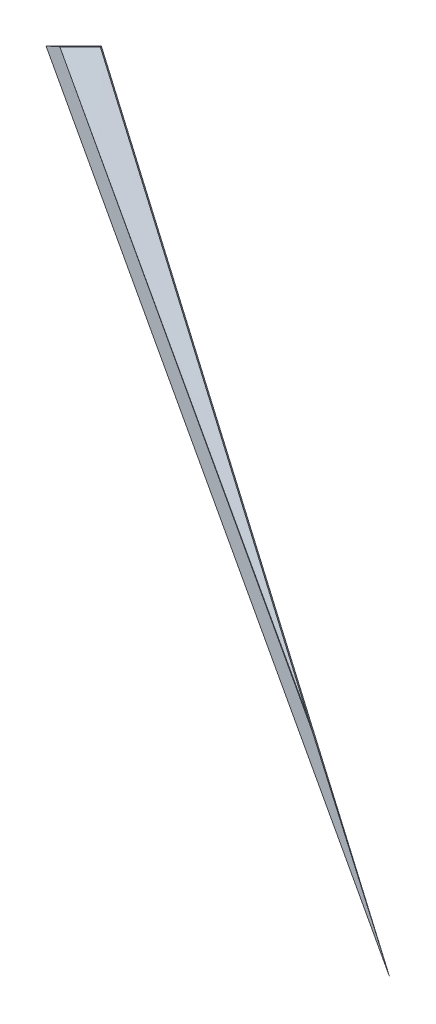
ISO-10303-21;
HEADER;
FILE_DESCRIPTION(('STEP AP214'),'2;1');
FILE_NAME('part.step','',(''),(''),'','','');
FILE_SCHEMA(('AUTOMOTIVE_DESIGN { 1 0 10303 214 1 1 1 1 }'));
ENDSEC;
DATA;
#1=APPLICATION_CONTEXT('core data for automotive mechanical design processes');
#2=APPLICATION_PROTOCOL_DEFINITION('international standard','automotive_design',2000,#1);
#3=PRODUCT_CONTEXT('',#1,'mechanical');
#4=PRODUCT('Part','Part','',(#3));
#5=PRODUCT_RELATED_PRODUCT_CATEGORY('part','',(#4));
#6=PRODUCT_DEFINITION_FORMATION('','',#4);
#7=PRODUCT_DEFINITION_CONTEXT('part definition',#1,'design');
#8=PRODUCT_DEFINITION('design','',#6,#7);
#9=PRODUCT_DEFINITION_SHAPE('','',#8);
#10=(LENGTH_UNIT() NAMED_UNIT(*) SI_UNIT(.MILLI.,.METRE.));
#11=(NAMED_UNIT(*) PLANE_ANGLE_UNIT() SI_UNIT($,.RADIAN.));
#12=(NAMED_UNIT(*) SI_UNIT($,.STERADIAN.) SOLID_ANGLE_UNIT());
#13=UNCERTAINTY_MEASURE_WITH_UNIT(LENGTH_MEASURE(1.E-05),#10,'distance_accuracy_value','');
#14=(GEOMETRIC_REPRESENTATION_CONTEXT(3) GLOBAL_UNCERTAINTY_ASSIGNED_CONTEXT((#13)) GLOBAL_UNIT_ASSIGNED_CONTEXT((#10,
#11,#12)) REPRESENTATION_CONTEXT('',''));
#15=CARTESIAN_POINT('',(0.,0.,0.));
#16=DIRECTION('',(0.,0.,1.));
#17=DIRECTION('',(1.,0.,0.));
#18=AXIS2_PLACEMENT_3D('',#15,#16,#17);
#19=CARTESIAN_POINT('',(-43.7794599718674,348.054082561375,128.512156547839));
#20=DIRECTION('',(0.320862040401385,0.0996172698804472,-0.941872576610566));
#21=DIRECTION('',(-0.946581032931167,0.,-0.322466041770238));
#22=AXIS2_PLACEMENT_3D('',#19,#20,#21);
#23=PLANE('',#22);
#24=CARTESIAN_POINT('',(-297.668741007395,361.646186737307,43.4587996198292));
#25=CARTESIAN_POINT('',(-290.734837231368,352.952606488045,44.9014531351215));
#26=CARTESIAN_POINT('',(-283.801097103595,344.258883957929,46.3440358529999));
#27=CARTESIAN_POINT('',(-269.93403174818,326.871078181952,49.2290217960901));
#28=CARTESIAN_POINT('',(-263.000706520539,318.176994936089,50.6714250213013));
#29=CARTESIAN_POINT('',(-249.13455930115,300.788392492688,53.5560139289091));
#30=CARTESIAN_POINT('',(-242.201737309353,292.093873295192,54.9981996113274));
#31=CARTESIAN_POINT('',(-228.336719033221,274.704291132399,57.8823003085134));
#32=CARTESIAN_POINT('',(-221.404522748887,266.009228167102,59.3242153232814));
#33=CARTESIAN_POINT('',(-206.979027083692,247.913566130506,62.3245718410815));
#34=CARTESIAN_POINT('',(-199.485794275591,238.512909212985,63.8829845470611));
#35=CARTESIAN_POINT('',(-184.500541335244,219.710541960795,66.999285429268));
#36=CARTESIAN_POINT('',(-177.008521202994,210.308831626128,68.5571736054967));
#37=CARTESIAN_POINT('',(-162.026121864654,191.503982930224,71.6722399181455));
#38=CARTESIAN_POINT('',(-154.535742658878,182.100844568712,73.2294180544297));
#39=CARTESIAN_POINT('',(-139.557273880719,163.292580400108,76.3427841289939));
#40=CARTESIAN_POINT('',(-132.069184308326,153.887454593026,77.8989720672789));
#41=CARTESIAN_POINT('',(-120.83956964729,139.777563962203,80.2321627182002));
#42=CARTESIAN_POINT('',(-117.096780853249,135.07389524907,81.0097118599945));
#43=CARTESIAN_POINT('',(-109.612252215599,125.665648549833,82.5643566346079));
#44=CARTESIAN_POINT('',(-105.870512371966,120.96107056375,83.3414522674373));
#45=CARTESIAN_POINT('',(-98.3883474690405,111.550779158204,84.8950755442062));
#46=CARTESIAN_POINT('',(-94.6479224091125,106.845065739291,85.6716031884202));
#47=CARTESIAN_POINT('',(-87.1687477131642,97.4321874708849,87.223934209572));
#48=CARTESIAN_POINT('',(-83.4299980772753,92.7250226212772,87.999737586453));
#49=CARTESIAN_POINT('',(-77.2005670496034,84.8781532171149,89.2919551041424));
#50=CARTESIAN_POINT('',(-74.7092761416948,81.738975930076,89.8086326516412));
#51=CARTESIAN_POINT('',(-69.7278803553843,75.4595964957376,90.8414753146593));
#52=CARTESIAN_POINT('',(-67.2377754769011,72.3193943485083,91.3576404302139));
#53=CARTESIAN_POINT('',(-62.2590220064572,66.0377334720408,92.3893416544394));
#54=CARTESIAN_POINT('',(-59.7703734142002,62.8962747430586,92.9048777632384));
#55=CARTESIAN_POINT('',(-54.7948894593718,56.6117853933132,93.9351660275048));
#56=CARTESIAN_POINT('',(-52.3080540994935,53.4687547702271,94.4499181818091));
#57=CARTESIAN_POINT('',(-47.336688284403,47.1807072070455,95.4784272094051));
#58=CARTESIAN_POINT('',(-44.8521578295679,44.0356902666253,95.992184082534));
#59=CARTESIAN_POINT('',(-41.1276090285872,39.3162311218819,96.7618494391306));
#60=CARTESIAN_POINT('',(-39.8864666830658,37.7427550751875,97.0182430144565));
#61=CARTESIAN_POINT('',(-37.4050513044177,34.5950563938029,97.5306550587348));
#62=CARTESIAN_POINT('',(-36.1647782713725,33.0208337590427,97.7866735276519));
#63=CARTESIAN_POINT('',(-34.9249999999667,31.4461867373069,98.0424785637693));
#64=B_SPLINE_CURVE_WITH_KNOTS('',3,(#24,#25,#26,#27,#28,#29,#30,#31,#32,#33,#34,#35,#36,#37,#38,
#39,#40,#41,#42,#43,#44,#45,#46,#47,#48,#49,#50,#51,#52,#53,#54,#55,#56,#57,#58,#59,#60,#61,#62,
#63),.UNSPECIFIED.,.F.,.F.,(4,2,2,2,2,2,2,2,2,2,2,2,2,2,2,2,2,2,2,4),(0.,33.6399684172129,
67.2799369411519,100.919902126164,134.559867272925,170.926690627021,207.293513887514,
243.660344114447,280.027174158575,298.21062666626,316.394078765369,334.577522073942,
352.76096680686,364.883312892877,377.005658149082,389.128000938074,401.250361695772,
413.372724436773,419.433911269494,425.495098671373),.UNSPECIFIED.);
#65=CARTESIAN_POINT('',(-297.668741542232,361.646186737307,43.4588001512512));
#66=VERTEX_POINT('',#65);
#67=CARTESIAN_POINT('',(-127.021603680379,147.545094915806,78.9477004072457));
#68=VERTEX_POINT('',#67);
#69=EDGE_CURVE('E200',#66,#68,#64,.T.);
#70=ORIENTED_EDGE('',*,*,#69,.T.);
#71=DIRECTION('',(-0.496730625068421,0.864411263879369,-0.0777936565383566));
#72=VECTOR('',#71,1.);
#73=CARTESIAN_POINT('',(-190.661492058989,258.291309403625,68.980971220812));
#74=LINE('',#73,#72);
#75=CARTESIAN_POINT('',(-163.166684475801,210.444810368408,73.2869703071807));
#76=VERTEX_POINT('',#75);
#77=EDGE_CURVE('E44',#68,#76,#74,.T.);
#78=ORIENTED_EDGE('',*,*,#77,.T.);
#79=CARTESIAN_POINT('',(-288.991942465316,368.569183758141,47.1468837972769));
#80=CARTESIAN_POINT('',(-277.176160376147,353.720231922855,49.6015936646894));
#81=CARTESIAN_POINT('',(-265.360372672012,338.871284956906,52.056305959925));
#82=CARTESIAN_POINT('',(-241.728778223119,309.173407535539,56.9657387830881));
#83=CARTESIAN_POINT('',(-229.912971478361,294.324477080122,59.4204593110157));
#84=CARTESIAN_POINT('',(-206.281331139202,264.626639453767,64.3299119762628));
#85=CARTESIAN_POINT('',(-194.4654975448,249.777732282829,66.7846441135824));
#86=CARTESIAN_POINT('',(-170.833788907019,220.079953887667,71.6941263103031));
#87=CARTESIAN_POINT('',(-159.017913863639,205.231082663442,74.1488763697041));
#88=CARTESIAN_POINT('',(-137.121299734128,177.714000399608,78.697915999562));
#89=CARTESIAN_POINT('',(-127.040569998214,165.045781251254,80.7922015271146));
#90=CARTESIAN_POINT('',(-106.879026578929,139.70941575874,84.9808088802371));
#91=CARTESIAN_POINT('',(-96.7982128955589,127.041269414581,87.075130705807));
#92=CARTESIAN_POINT('',(-76.6364336295457,101.705108454056,91.2638400357607));
#93=CARTESIAN_POINT('',(-66.5554680469028,89.0370938376907,93.3582275401446));
#94=CARTESIAN_POINT('',(-51.4337702057868,70.0352882688985,96.4999166640812));
#95=CARTESIAN_POINT('',(-46.3931626800952,63.7013891375956,97.5471643501186));
#96=CARTESIAN_POINT('',(-36.3117975323069,51.0337210558875,99.6417246232276));
#97=CARTESIAN_POINT('',(-31.2710399102102,44.6999521054824,100.689037210299));
#98=CARTESIAN_POINT('',(-26.2301737705843,38.3662772779605,101.7363967203));
#99=B_SPLINE_CURVE_WITH_KNOTS('',3,(#79,#80,#81,#82,#83,#84,#85,#86,#87,#88,#89,#90,#91,#92,#93,
#94,#95,#96,#97,#98),.UNSPECIFIED.,.F.,.F.,(4,2,2,2,2,2,2,2,2,4),(0.,57.4035460374113,
114.807092078777,172.210638119967,229.614184158014,278.58783301537,327.561481868416,
376.535130736395,401.021955178102,425.508779626037),.UNSPECIFIED.);
#100=CARTESIAN_POINT('',(-288.445979296067,367.883069094712,47.2603067692651));
#101=VERTEX_POINT('',#100);
#102=EDGE_CURVE('E92',#101,#76,#99,.T.);
#103=ORIENTED_EDGE('',*,*,#102,.F.);
#104=CARTESIAN_POINT('',(-297.668741201082,361.646186605967,43.4587995399557));
#105=CARTESIAN_POINT('',(-297.284680488669,361.906518556013,43.6169732194297));
#106=CARTESIAN_POINT('',(-296.900592144994,362.166792846223,43.7751747077112));
#107=CARTESIAN_POINT('',(-296.132360196487,362.687226053781,44.0916333005164));
#108=CARTESIAN_POINT('',(-295.748216591655,362.947384971126,44.2498904050412));
#109=CARTESIAN_POINT('',(-294.979874122189,363.467587379757,44.5664602289685));
#110=CARTESIAN_POINT('',(-294.595675257554,363.727630871037,44.7247729483734));
#111=CARTESIAN_POINT('',(-293.827222269861,364.247602374327,45.0414540006726));
#112=CARTESIAN_POINT('',(-293.4429681468,364.50753038633,45.1998223335704));
#113=CARTESIAN_POINT('',(-292.674404643652,365.027270877842,45.5166146114519));
#114=CARTESIAN_POINT('',(-292.290095263561,365.287083357343,45.6750385564402));
#115=CARTESIAN_POINT('',(-291.521421247763,365.806592730617,45.9919420570808));
#116=CARTESIAN_POINT('',(-291.137056612051,366.066289624379,46.1504216127389));
#117=CARTESIAN_POINT('',(-290.368272086441,366.585567772931,46.4674363332822));
#118=CARTESIAN_POINT('',(-289.983852196535,366.845149027706,46.6259714981742));
#119=CARTESIAN_POINT('',(-289.214957163991,367.364195845026,46.9430974357243));
#120=CARTESIAN_POINT('',(-288.830482021344,367.623661407553,47.1016882083903));
#121=CARTESIAN_POINT('',(-288.4459792844,367.883069076182,47.2603067712797));
#122=B_SPLINE_CURVE_WITH_KNOTS('',3,(#104,#105,#106,#107,#108,#109,#110,#111,#112,#113,#114,
#115,#116,#117,#118,#119,#120,#121),.UNSPECIFIED.,.F.,.F.,(4,2,2,2,2,2,2,2,4),(0.,
1.470594572505,2.94118917486206,4.41178383696294,5.88237858873328,7.35297346013329,
8.82356848115738,10.2941636818343,11.7647590922271),.UNSPECIFIED.);
#123=EDGE_CURVE('E77',#101,#66,#122,.F.);
#124=ORIENTED_EDGE('',*,*,#123,.T.);
#125=EDGE_LOOP('',(#70,#78,#103,#124));
#126=FACE_BOUND('',#125,.T.);
#127=ADVANCED_FACE('F38',(#126),#23,.F.);
#128=CARTESIAN_POINT('',(-108.724229990897,312.439251428831,147.462223686257));
#129=DIRECTION('',(0.573127406974514,0.259388760360691,-0.777330332852909));
#130=DIRECTION('',(-0.804878930909419,0.,-0.593439050432403));
#131=AXIS2_PLACEMENT_3D('',#128,#129,#130);
#132=PLANE('',#131);
#133=CARTESIAN_POINT('',(-286.757859557842,361.646186737307,32.6175781807756));
#134=CARTESIAN_POINT('',(-283.324879280508,357.011977166067,33.6023245315298));
#135=CARTESIAN_POINT('',(-279.891473903881,352.378178145007,34.5875213061813));
#136=CARTESIAN_POINT('',(-273.023706396748,343.111506066348,36.5589292586926));
#137=CARTESIAN_POINT('',(-269.589344266381,338.478633008615,37.5451404364053));
#138=CARTESIAN_POINT('',(-262.719556232259,329.213917092226,39.5186908833365));
#139=CARTESIAN_POINT('',(-259.284130328667,324.58207423341,40.5060301523805));
#140=CARTESIAN_POINT('',(-252.412086156816,315.319543866885,42.4819733548205));
#141=CARTESIAN_POINT('',(-248.975467888711,310.688856359024,43.470577288052));
#142=CARTESIAN_POINT('',(-242.100924747281,301.428828039547,45.4491978989877));
#143=CARTESIAN_POINT('',(-238.66299988754,296.799487214768,46.4392145622841));
#144=CARTESIAN_POINT('',(-231.785633902103,287.542275609962,48.4208563770674));
#145=CARTESIAN_POINT('',(-228.346192776269,282.914404830069,49.4124815287014));
#146=CARTESIAN_POINT('',(-221.465587615851,273.660334081903,51.3975596726163));
#147=CARTESIAN_POINT('',(-218.024423580753,269.034134114128,52.3910126654435));
#148=CARTESIAN_POINT('',(-211.14012677169,259.783643800331,54.3800074318285));
#149=CARTESIAN_POINT('',(-207.69699399652,255.159353455479,55.3755492066656));
#150=CARTESIAN_POINT('',(-200.808354849825,245.912820715994,57.3690661984851));
#151=CARTESIAN_POINT('',(-197.36284840357,241.290578394143,58.3670414948528));
#152=CARTESIAN_POINT('',(-190.469222264212,232.048644449128,60.3657699876248));
#153=CARTESIAN_POINT('',(-187.021102571434,227.428952825647,61.3665231836842));
#154=CARTESIAN_POINT('',(-180.121821476563,218.192550525306,63.3712669523906));
#155=CARTESIAN_POINT('',(-176.670660077157,213.575839845821,64.3752575221816));
#156=CARTESIAN_POINT('',(-169.764766700067,204.345927696207,66.3870422515745));
#157=CARTESIAN_POINT('',(-166.310034726793,199.732726221758,67.3948364064839));
#158=CARTESIAN_POINT('',(-159.396301299201,190.510439345044,69.4149461138513));
#159=CARTESIAN_POINT('',(-155.937299802372,185.901353984561,70.4272617115948));
#160=CARTESIAN_POINT('',(-149.014233232903,176.688173597478,72.4572915264554));
#161=CARTESIAN_POINT('',(-145.550168158609,172.084078572506,73.4750057453347));
#162=CARTESIAN_POINT('',(-140.349469513132,165.182483302767,75.0064868123872));
#163=CARTESIAN_POINT('',(-138.615134167171,162.882706392183,75.5177994691999));
#164=CARTESIAN_POINT('',(-135.144766476657,158.284837685361,76.5422382925585));
#165=CARTESIAN_POINT('',(-133.408734132276,155.986745888953,77.0553644589202));
#166=CARTESIAN_POINT('',(-129.934780113806,151.392416110681,78.0836284014148));
#167=CARTESIAN_POINT('',(-128.196858427237,149.096178141241,78.5987661908956));
#168=CARTESIAN_POINT('',(-124.718919252398,144.505793408598,79.6312848275553));
#169=CARTESIAN_POINT('',(-122.978901763381,142.211646646142,80.148665675535));
#170=CARTESIAN_POINT('',(-121.237727997419,139.918657356266,80.6672852882252));
#171=B_SPLINE_CURVE_WITH_KNOTS('',3,(#133,#134,#135,#136,#137,#138,#139,#140,#141,#142,#143,
#144,#145,#146,#147,#148,#149,#150,#151,#152,#153,#154,#155,#156,#157,#158,#159,#160,#161,#162,
#163,#164,#165,#166,#167,#168,#169,#170),.UNSPECIFIED.,.F.,.F.,(4,2,2,2,2,2,2,2,2,2,2,2,2,2,2,2,
2,2,4),(0.,17.552173572479,35.1043445993098,52.6565129101434,70.2086789384544,87.7606672205361,
105.312657108009,122.864652241527,140.416658127242,157.969244458604,175.5218286105,
193.074397281571,210.62694430465,228.17966752506,245.732396475044,254.50878411403,
263.285170861463,272.061615943047,280.838064158074),.UNSPECIFIED.);
#172=CARTESIAN_POINT('',(-286.757859557842,361.646186737307,32.6175781807756));
#173=VERTEX_POINT('',#172);
#174=EDGE_CURVE('E56',#173,#68,#171,.T.);
#175=ORIENTED_EDGE('',*,*,#174,.F.);
#176=CARTESIAN_POINT('',(-280.4456428073,367.850614043495,39.3419563573161));
#177=CARTESIAN_POINT('',(-281.508104015321,366.806075040956,38.2100472100795));
#178=CARTESIAN_POINT('',(-282.570613385615,365.761600279045,37.0781239892606));
#179=CARTESIAN_POINT('',(-284.164449569809,364.194984348807,35.3802180827064));
#180=CARTESIAN_POINT('',(-284.695740321155,363.672795072375,34.8142459326918));
#181=CARTESIAN_POINT('',(-285.758345846837,362.628448566472,33.6822946142679));
#182=CARTESIAN_POINT('',(-286.289660621172,362.106291337002,33.1163154458585));
#183=CARTESIAN_POINT('',(-286.820987396641,361.584150119446,32.5503327720306));
#184=B_SPLINE_CURVE_WITH_KNOTS('',3,(#176,#177,#178,#179,#180,#181,#182,#183),.UNSPECIFIED.,.F.,
.F.,(4,2,2,4),(0.,5.61337106720591,8.42005662007123,11.2267421782396),.UNSPECIFIED.);
#185=CARTESIAN_POINT('',(-280.445642947806,367.850614124864,39.3419563310312));
#186=VERTEX_POINT('',#185);
#187=EDGE_CURVE('E198',#186,#173,#184,.T.);
#188=ORIENTED_EDGE('',*,*,#187,.F.);
#189=CARTESIAN_POINT('',(-280.445643025809,367.850614210294,39.3419562518684));
#190=CARTESIAN_POINT('',(-277.46401444205,363.82621562409,40.1974089084731));
#191=CARTESIAN_POINT('',(-274.482033070197,359.802157825853,41.0532353946855));
#192=CARTESIAN_POINT('',(-268.51728339212,351.754803003423,42.7657224396593));
#193=CARTESIAN_POINT('',(-265.534515085894,347.731505979229,43.6223829984216));
#194=CARTESIAN_POINT('',(-259.568110322113,339.68575209345,45.3366245612537));
#195=CARTESIAN_POINT('',(-256.584473864598,335.663295231826,46.1942055652818));
#196=CARTESIAN_POINT('',(-250.616236578857,327.619315610051,47.9103903080405));
#197=CARTESIAN_POINT('',(-247.631635750694,323.59779284984,48.7689940467061));
#198=CARTESIAN_POINT('',(-241.661381467194,315.555818024593,50.4873349106292));
#199=CARTESIAN_POINT('',(-238.67572801974,311.53536595192,51.3470720275266));
#200=CARTESIAN_POINT('',(-232.703219128181,303.495627395489,53.0678214436281));
#201=CARTESIAN_POINT('',(-229.716363684034,299.476340911773,53.9288337428777));
#202=CARTESIAN_POINT('',(-223.741302416589,291.439077992534,55.6522911313132));
#203=CARTESIAN_POINT('',(-220.753096593073,287.421101557221,56.5147362207297));
#204=CARTESIAN_POINT('',(-214.775160940708,279.386627698012,58.2412435861173));
#205=CARTESIAN_POINT('',(-211.785431111303,275.370130274655,59.1053058626781));
#206=CARTESIAN_POINT('',(-205.804172787772,267.338718855781,60.8352849522458));
#207=CARTESIAN_POINT('',(-202.812644251898,263.323804900904,61.7012018095937));
#208=CARTESIAN_POINT('',(-196.827620199856,255.29589519653,63.4351258727069));
#209=CARTESIAN_POINT('',(-193.834124683814,251.282899446909,64.3031330783381));
#210=CARTESIAN_POINT('',(-187.844881220989,243.259111536922,66.0415435315362));
#211=CARTESIAN_POINT('',(-184.849133275382,239.248319375407,66.9119467778524));
#212=CARTESIAN_POINT('',(-178.855041272518,231.229280882976,68.6555169122607));
#213=CARTESIAN_POINT('',(-175.856697217129,227.221034550232,69.5286837983646));
#214=CARTESIAN_POINT('',(-169.856972792828,219.207470392375,71.278233470372));
#215=CARTESIAN_POINT('',(-166.855592402167,215.202152588599,72.1546162794303));
#216=CARTESIAN_POINT('',(-160.849307808042,207.194982015475,73.9111362662565));
#217=CARTESIAN_POINT('',(-157.844403603806,203.193129246886,74.7912734448473));
#218=CARTESIAN_POINT('',(-151.830442736202,195.193511048327,76.5559733309033));
#219=CARTESIAN_POINT('',(-148.821386066734,191.195745624374,77.4405360448727));
#220=CARTESIAN_POINT('',(-144.304097766052,185.202754111899,78.7713307499456));
#221=CARTESIAN_POINT('',(-142.797714893009,183.205695888404,79.215588279058));
#222=CARTESIAN_POINT('',(-139.783595922367,179.212922766278,80.1055493292954));
#223=CARTESIAN_POINT('',(-138.275859824533,177.21720786788,80.5512528506709));
#224=CARTESIAN_POINT('',(-136.767387021987,175.222225922572,80.9977441265302));
#225=B_SPLINE_CURVE_WITH_KNOTS('',3,(#189,#190,#191,#192,#193,#194,#195,#196,#197,#198,#199,
#200,#201,#202,#203,#204,#205,#206,#207,#208,#209,#210,#211,#212,#213,#214,#215,#216,#217,#218,
#219,#220,#221,#222,#223,#224),.UNSPECIFIED.,.F.,.F.,(4,2,2,2,2,2,2,2,2,2,2,2,2,2,2,2,2,4),(0.,
15.2433339819583,30.4866679792013,45.7300012853449,60.9733336208286,76.2165541387022,
91.4597751992048,106.702998711841,121.946227782359,137.189825463792,152.433422168947,
167.677010918932,182.920588704763,198.164276461993,213.407967560764,228.651681069361,
236.273567033726,243.895454318526),.UNSPECIFIED.);
#226=CARTESIAN_POINT('',(-165.275467023449,213.095940456701,72.6168205597275));
#227=VERTEX_POINT('',#226);
#228=EDGE_CURVE('E102',#186,#227,#225,.T.);
#229=ORIENTED_EDGE('',*,*,#228,.T.);
#230=CARTESIAN_POINT('',(-193.689419999051,248.818566275212,63.5874963892034));
#231=CARTESIAN_POINT('',(-187.847089996564,241.473296716984,65.4440032290879));
#232=CARTESIAN_POINT('',(-182.004722660323,234.128067185333,67.3005509517733));
#233=CARTESIAN_POINT('',(-170.319886904974,219.437716568774,71.0137571135606));
#234=CARTESIAN_POINT('',(-164.477418485864,212.092595483866,72.870415552662));
#235=CARTESIAN_POINT('',(-152.792354242837,197.402490271822,76.5838720684045));
#236=CARTESIAN_POINT('',(-146.949758418921,190.057506144683,78.440670145042));
#237=CARTESIAN_POINT('',(-135.264399259331,175.367717452861,82.1544497236347));
#238=CARTESIAN_POINT('',(-129.421635923655,168.022912888179,84.0114312255907));
#239=CARTESIAN_POINT('',(-118.172113570778,153.881900283799,87.5869894260672));
#240=CARTESIAN_POINT('',(-112.765370752731,147.08567487165,89.3055483838696));
#241=CARTESIAN_POINT('',(-101.951623822872,133.493504338538,92.7429524828286));
#242=CARTESIAN_POINT('',(-96.5446197110605,126.697559217574,94.4617976239843));
#243=CARTESIAN_POINT('',(-85.7302450891944,113.106062167317,97.8998892573831));
#244=CARTESIAN_POINT('',(-80.3228745791445,106.310510238018,99.6191357496215));
#245=CARTESIAN_POINT('',(-69.5076006528484,92.7199776660635,103.058212280708));
#246=CARTESIAN_POINT('',(-64.0996972365823,85.9249970234298,104.778042319579));
#247=CARTESIAN_POINT('',(-55.9872192917431,75.73319448848,107.358469634077));
#248=CARTESIAN_POINT('',(-53.2829561606486,72.3360383656608,108.218725785664));
#249=CARTESIAN_POINT('',(-47.8741607514147,65.542015097691,109.939532961038));
#250=CARTESIAN_POINT('',(-45.1696284732765,62.1451479525391,110.800083984825));
#251=CARTESIAN_POINT('',(-39.7602168313234,55.3517859919002,112.521566182808));
#252=CARTESIAN_POINT('',(-37.055337467487,51.9552911764364,113.382497357028));
#253=CARTESIAN_POINT('',(-31.6451002258488,45.1628155667403,115.104884039565));
#254=CARTESIAN_POINT('',(-28.9397423480402,41.7668347725157,115.96633954789));
#255=CARTESIAN_POINT('',(-26.2340794545243,38.3711817786632,116.82812932928));
#256=B_SPLINE_CURVE_WITH_KNOTS('',3,(#230,#231,#232,#233,#234,#235,#236,#237,#238,#239,#240,
#241,#242,#243,#244,#245,#246,#247,#248,#249,#250,#251,#252,#253,#254,#255),.UNSPECIFIED.,.F.,
.F.,(4,2,2,2,2,2,2,2,2,2,2,2,4),(0.,28.7017734915153,57.4035468469286,86.1053194711997,
114.807092233725,141.365987793161,167.924883262243,194.483778413571,221.042674563214,
234.322122763157,247.601570906753,260.881019877237,274.160469042199),.UNSPECIFIED.);
#257=EDGE_CURVE('E89',#227,#76,#256,.T.);
#258=ORIENTED_EDGE('',*,*,#257,.T.);
#259=ORIENTED_EDGE('',*,*,#77,.F.);
#260=EDGE_LOOP('',(#175,#188,#229,#258,#259));
#261=FACE_BOUND('',#260,.T.);
#262=ADVANCED_FACE('F178',(#261),#132,.T.);
#263=CARTESIAN_POINT('',(-297.73351409703,361.583707070747,43.3936114019423));
#264=CARTESIAN_POINT('',(-265.916659572022,361.58499252846,11.7786580540092));
#265=CARTESIAN_POINT('',(-234.09980366564,361.586333054343,-19.8362939036235));
#266=CARTESIAN_POINT('',(-202.282942677506,361.587731212742,-51.4512407467071));
#267=CARTESIAN_POINT('',(-201.964774067624,361.587745194326,-51.7673902151379));
#268=CARTESIAN_POINT('',(-201.646605457743,361.58775917591,-52.0835396835688));
#269=CARTESIAN_POINT('',(-201.328436847862,361.587773157494,-52.3996891519996));
#270=CARTESIAN_POINT('',(-297.668741542232,361.646186737307,43.4588001512513));
#271=CARTESIAN_POINT('',(-265.851271011261,361.646186737307,11.8444667674944));
#272=CARTESIAN_POINT('',(-234.03380048029,361.646186737307,-19.769866616263));
#273=CARTESIAN_POINT('',(-202.216329949319,361.646186737307,-51.3842000000199));
#274=CARTESIAN_POINT('',(-201.898155244009,361.646186737307,-51.7003433338574));
#275=CARTESIAN_POINT('',(-201.5799805387,361.646186737307,-52.016486667695));
#276=CARTESIAN_POINT('',(-201.26180583339,361.646186737307,-52.3326300015326));
#277=CARTESIAN_POINT('',(-291.191486062361,367.894153393254,49.9776750821469));
#278=CARTESIAN_POINT('',(-259.312414935143,367.76560762204,18.4253381160208));
#279=CARTESIAN_POINT('',(-227.433481945308,367.631555033677,-13.1271378802075));
#280=CARTESIAN_POINT('',(-195.555057130655,367.491739193792,-44.6801253312971));
#281=CARTESIAN_POINT('',(-195.236272882508,367.490341035393,-44.995655205808));
#282=CARTESIAN_POINT('',(-194.917488634362,367.488942876994,-45.3111850803189));
#283=CARTESIAN_POINT('',(-194.598704386215,367.487544718595,-45.6267149548298));
#284=B_SPLINE_SURFACE_WITH_KNOTS('',1,3,((#263,#264,#265,#266,#267,#268,#269),(#270,#271,#272,
#273,#274,#275,#276),(#277,#278,#279,#280,#281,#282,#283)),.UNSPECIFIED.,.F.,.F.,.F.,(2,1,2),(4,
3,4),(-0.01,0.,1.),(-0.0672799330346664,0.0672799330346665,0.0686255316953598),.UNSPECIFIED.);
#285=CARTESIAN_POINT('',(-288.445979287918,367.883069077555,47.260306777569));
#286=CARTESIAN_POINT('',(-288.112631796813,367.881721613959,46.9303756511238));
#287=CARTESIAN_POINT('',(-287.779284323173,367.880373547442,46.6004445094951));
#288=CARTESIAN_POINT('',(-287.11258940927,367.877676207969,45.9405821926446));
#289=CARTESIAN_POINT('',(-286.779241969007,367.876326935013,45.6106510174229));
#290=CARTESIAN_POINT('',(-286.112547122705,367.873627182076,44.9507886325347));
#291=CARTESIAN_POINT('',(-285.779199716666,367.872276702095,44.6208574228683));
#292=CARTESIAN_POINT('',(-285.112504939658,367.869574534522,43.9609949682392));
#293=CARTESIAN_POINT('',(-284.779157568688,367.868222846929,43.6310637232765));
#294=CARTESIAN_POINT('',(-284.112462862665,367.865518263547,42.9712011972033));
#295=CARTESIAN_POINT('',(-283.779115527611,367.864165367756,42.6412699160928));
#296=CARTESIAN_POINT('',(-283.112420894266,367.861458367391,41.9814073168722));
#297=CARTESIAN_POINT('',(-282.779073595974,367.860104262817,41.6514759987621));
#298=CARTESIAN_POINT('',(-282.112379036999,367.857394844297,40.9916133246909));
#299=CARTESIAN_POINT('',(-281.779031776316,367.856039530352,40.6616819687298));
#300=CARTESIAN_POINT('',(-281.112337293403,367.853327692505,40.0018192181047));
#301=CARTESIAN_POINT('',(-280.778990071174,367.851971168603,39.6718878234409));
#302=CARTESIAN_POINT('',(-280.445642869802,367.850614039434,39.341956410194));
#303=B_SPLINE_CURVE_WITH_KNOTS('',3,(#285,#286,#287,#288,#289,#290,#291,#292,#293,#294,#295,
#296,#297,#298,#299,#300,#301,#302),.UNSPECIFIED.,.F.,.F.,(4,2,2,2,2,2,2,2,4),(0.,
1.40705089571522,2.81410180156379,4.22115271755293,5.62820364369011,7.03525457998287,
8.44230552643854,9.8493564830646,11.2564074498687),.UNSPECIFIED.);
#304=EDGE_CURVE('E11',#101,#186,#303,.T.);
#305=CARTESIAN_POINT('',(-297.668741542232,361.646186737307,43.4588001512512));
#306=CARTESIAN_POINT('',(-281.760006276746,361.646186737307,27.6516334593727));
#307=CARTESIAN_POINT('',(-265.851271011261,361.646186737307,11.8444667674942));
#308=CARTESIAN_POINT('',(-234.03380048029,361.646186737307,-19.7698666162628));
#309=CARTESIAN_POINT('',(-218.125065214804,361.646186737307,-35.5770333081413));
#310=CARTESIAN_POINT('',(-202.216329949319,361.646186737307,-51.3842000000199));
#311=B_SPLINE_CURVE_WITH_KNOTS('',3,(#305,#306,#307,#308,#309,#310),.UNSPECIFIED.,.F.,.F.,(4,2,
4),(0.,0.5,1.),.UNSPECIFIED.);
#312=EDGE_CURVE('E84',#66,#173,#311,.T.);
#313=ORIENTED_EDGE('',*,*,#304,.T.);
#314=ORIENTED_EDGE('',*,*,#187,.T.);
#315=ORIENTED_EDGE('',*,*,#312,.F.);
#316=ORIENTED_EDGE('',*,*,#123,.F.);
#317=EDGE_LOOP('',(#313,#314,#315,#316));
#318=FACE_BOUND('',#317,.T.);
#319=ADVANCED_FACE('F80',(#318),#284,.T.);
#320=CARTESIAN_POINT('',(-34.9249999999667,31.4461867373069,70.3072000000032));
#321=CARTESIAN_POINT('',(-202.216329949319,361.646186737307,-51.3842000000199));
#322=CARTESIAN_POINT('',(-34.9249999999667,31.4461867373069,75.067706768235));
#323=CARTESIAN_POINT('',(-218.125065214804,361.646186737307,-35.5770333081413));
#324=CARTESIAN_POINT('',(-34.9249999999667,31.4461867373069,79.8282135364669));
#325=CARTESIAN_POINT('',(-234.03380048029,361.646186737307,-19.7698666162628));
#326=CARTESIAN_POINT('',(-34.9249999999667,31.4461867373069,89.3492270729307));
#327=CARTESIAN_POINT('',(-265.851271011261,361.646186737307,11.8444667674942));
#328=CARTESIAN_POINT('',(-34.9249999999667,31.4461867373069,94.1097338411627));
#329=CARTESIAN_POINT('',(-281.760006276746,361.646186737307,27.6516334593727));
#330=CARTESIAN_POINT('',(-34.9249999999667,31.4461867373069,98.8702406093947));
#331=CARTESIAN_POINT('',(-297.668741542232,361.646186737307,43.4588001512512));
#332=B_SPLINE_SURFACE_WITH_KNOTS('',3,1,((#320,#321),(#322,#323),(#324,#325),(#326,#327),(#328,
#329),(#330,#331)),.UNSPECIFIED.,.F.,.F.,.F.,(4,2,4),(2,2),(0.,0.5,1.),(0.,1.),.UNSPECIFIED.);
#333=OFFSET_SURFACE('',#332,-11.1125,.F.);
#334=ORIENTED_EDGE('',*,*,#228,.F.);
#335=ORIENTED_EDGE('',*,*,#304,.F.);
#336=CARTESIAN_POINT('',(-313.200793758775,398.992617287791,42.1121953414393));
#337=CARTESIAN_POINT('',(-306.728547723773,390.858888454323,43.4595033941758));
#338=CARTESIAN_POINT('',(-300.256222897436,382.725069371518,44.8058888634204));
#339=CARTESIAN_POINT('',(-287.311380121952,366.457209233086,47.496394632559));
#340=CARTESIAN_POINT('',(-280.838862172791,358.323168177443,48.8405149322795));
#341=CARTESIAN_POINT('',(-267.893648319999,342.054886344672,51.526059839455));
#342=CARTESIAN_POINT('',(-261.420952418118,333.920645569559,52.8674844675364));
#343=CARTESIAN_POINT('',(-248.475286426359,317.651847402649,55.5470834449821));
#344=CARTESIAN_POINT('',(-242.002316336493,309.517290010868,56.8852577944998));
#345=CARTESIAN_POINT('',(-229.05602776139,293.247770236827,59.5576345779438));
#346=CARTESIAN_POINT('',(-222.582709275419,285.112807853715,60.8918370031298));
#347=CARTESIAN_POINT('',(-209.635660487677,268.842404367205,63.5553153693132));
#348=CARTESIAN_POINT('',(-203.161930185918,260.706963263819,64.8845913104437));
#349=CARTESIAN_POINT('',(-192.371913291853,247.147347115006,67.0948746550161));
#350=CARTESIAN_POINT('',(-188.055770187472,241.723339567723,67.977610007342));
#351=CARTESIAN_POINT('',(-179.423214732611,230.87500920818,69.7398146573383));
#352=CARTESIAN_POINT('',(-175.106802382166,225.450686395961,70.6192839554229));
#353=CARTESIAN_POINT('',(-166.473660892845,214.601668642824,72.3743415684595));
#354=CARTESIAN_POINT('',(-162.156931754104,209.176973702064,73.2499298850504));
#355=CARTESIAN_POINT('',(-153.948002494875,198.861103566912,74.9104907688055));
#356=CARTESIAN_POINT('',(-150.055837932546,193.969970325269,75.6958996392697));
#357=CARTESIAN_POINT('',(-142.271143503016,184.187271059716,77.2622056778986));
#358=CARTESIAN_POINT('',(-138.378613635777,179.295705035759,78.0431028455904));
#359=CARTESIAN_POINT('',(-130.593115584151,169.512051091138,79.599477467054));
#360=CARTESIAN_POINT('',(-126.700147399328,164.619963169953,80.3749549153773));
#361=CARTESIAN_POINT('',(-118.913680233663,154.835151728977,81.9193311384836));
#362=CARTESIAN_POINT('',(-115.020181251596,149.94242820772,82.6882298978179));
#363=CARTESIAN_POINT('',(-107.232594177999,140.15627422987,84.2179402240021));
#364=CARTESIAN_POINT('',(-103.338506093427,135.262843781651,84.9787518797997));
#365=CARTESIAN_POINT('',(-95.549559269975,125.475048356405,86.4903386316605));
#366=CARTESIAN_POINT('',(-91.6547005314679,120.580683379828,87.2411137325687));
#367=CARTESIAN_POINT('',(-83.8640426989813,110.790802991298,88.7300307752195));
#368=CARTESIAN_POINT('',(-79.968243607885,105.895287582872,89.46817275521));
#369=CARTESIAN_POINT('',(-72.1754727535316,96.1028056186538,90.9283737501746));
#370=CARTESIAN_POINT('',(-68.2785009932688,91.2058390665676,91.6504328058673));
#371=CARTESIAN_POINT('',(-62.2677211745392,83.6526435265567,92.7479150123759));
#372=CARTESIAN_POINT('',(-60.1544324456326,80.9970673667866,93.1306770078338));
#373=CARTESIAN_POINT('',(-55.9273654465806,75.6852927567097,93.889137608063));
#374=CARTESIAN_POINT('',(-53.8135871762033,73.0290943061082,94.2648362094826));
#375=CARTESIAN_POINT('',(-49.5854918795417,67.7160032516885,95.0080837188343));
#376=CARTESIAN_POINT('',(-47.4711748555081,65.0591106507691,95.3756326602655));
#377=CARTESIAN_POINT('',(-43.241931248715,59.7445272281816,96.1013201727814));
#378=CARTESIAN_POINT('',(-41.1270046665489,57.0868364072904,96.4594587529949));
#379=CARTESIAN_POINT('',(-37.8792039450918,53.005493713575,97.0010164951079));
#380=CARTESIAN_POINT('',(-36.746570183828,51.5821636760391,97.1883068263792));
#381=CARTESIAN_POINT('',(-34.4810996828994,48.735227679477,97.5595329141727));
#382=CARTESIAN_POINT('',(-33.3482629432692,47.3116217204977,97.7434686712652));
#383=CARTESIAN_POINT('',(-31.206096191069,44.619592064578,98.0878443442977));
#384=CARTESIAN_POINT('',(-30.1967880335968,43.3511986032493,98.2486566223364));
#385=CARTESIAN_POINT('',(-28.2187128218902,40.8653334845311,98.5608086808905));
#386=CARTESIAN_POINT('',(-27.2499526331681,39.64787150518,98.7122689041245));
#387=CARTESIAN_POINT('',(-26.2638845196541,38.4086429493997,98.8649088894167));
#388=CARTESIAN_POINT('',(-26.2466582409289,38.3869940380224,98.8675749846575));
#389=CARTESIAN_POINT('',(-26.2294319363748,38.3653450894073,98.8702406093947));
#390=B_SPLINE_CURVE_WITH_KNOTS('',3,(#336,#337,#338,#339,#340,#341,#342,#343,#344,#345,#346,
#347,#348,#349,#350,#351,#352,#353,#354,#355,#356,#357,#358,#359,#360,#361,#362,#363,#364,#365,
#366,#367,#368,#369,#370,#371,#372,#373,#374,#375,#376,#377,#378,#379,#380,#381,#382,#383,#384,
#385,#386,#387,#388,#389),.UNSPECIFIED.,.F.,.F.,(4,2,2,2,2,2,2,2,2,2,2,2,2,2,2,2,2,2,2,2,2,2,2,
2,2,2,4),(0.,31.444630363456,62.8892631366473,94.333654382555,125.778044144665,157.222503049871,
188.666961105852,209.630107616148,230.593251466576,251.556386462998,270.456146174561,
289.355907867148,308.255688557141,327.15551361731,346.05513058812,364.954738435024,
383.854289051465,402.753791812699,412.999820581258,423.245854211543,433.49184571778,
443.73782728432,449.223647157608,454.709466098083,459.596228324202,464.285878796418,
464.36926196591),.UNSPECIFIED.);
#391=EDGE_CURVE('E49',#227,#101,#390,.F.);
#392=ORIENTED_EDGE('',*,*,#391,.F.);
#393=EDGE_LOOP('',(#334,#335,#392));
#394=FACE_BOUND('',#393,.T.);
#395=ADVANCED_FACE('F100',(#394),#333,.F.);
#396=CARTESIAN_POINT('',(-34.9249999999667,31.4461867373069,98.8702406093947));
#397=CARTESIAN_POINT('',(-297.668741542232,361.646186737307,43.4588001512512));
#398=CARTESIAN_POINT('',(-34.9249999999667,31.4461867373069,115.104738841413));
#399=CARTESIAN_POINT('',(-297.996236872092,361.646186737307,119.938468745316));
#400=CARTESIAN_POINT('',(-34.9249999999667,31.4461867373069,131.339237073432));
#401=CARTESIAN_POINT('',(-298.323732201952,361.646186737307,196.418137339381));
#402=CARTESIAN_POINT('',(-34.9249999999667,31.4461867373069,163.808233537469));
#403=CARTESIAN_POINT('',(-298.978722861673,361.646186737307,349.37747452751));
#404=CARTESIAN_POINT('',(-34.9249999999667,31.4461867373069,180.042731769488));
#405=CARTESIAN_POINT('',(-299.306218191534,361.646186737307,425.857143121575));
#406=CARTESIAN_POINT('',(-34.9249999999667,31.4461867373069,196.277230001507));
#407=CARTESIAN_POINT('',(-299.633713521394,361.646186737307,502.336811715639));
#408=B_SPLINE_SURFACE_WITH_KNOTS('',3,1,((#396,#397),(#398,#399),(#400,#401),(#402,#403),(#404,
#405),(#406,#407)),.UNSPECIFIED.,.F.,.F.,.F.,(4,2,4),(2,2),(0.,0.5,1.),(0.,1.),.UNSPECIFIED.);
#409=OFFSET_SURFACE('',#408,-11.1125,.F.);
#410=ORIENTED_EDGE('',*,*,#391,.T.);
#411=ORIENTED_EDGE('',*,*,#102,.T.);
#412=ORIENTED_EDGE('',*,*,#257,.F.);
#413=EDGE_LOOP('',(#410,#411,#412));
#414=FACE_BOUND('',#413,.T.);
#415=ADVANCED_FACE('F105',(#414),#409,.F.);
#416=CARTESIAN_POINT('',(-34.9249999999667,31.4461867373069,70.3072000000032));
#417=CARTESIAN_POINT('',(-202.216329949319,361.646186737307,-51.3842000000199));
#418=CARTESIAN_POINT('',(-34.9249999999667,31.4461867373069,75.067706768235));
#419=CARTESIAN_POINT('',(-218.125065214804,361.646186737307,-35.5770333081413));
#420=CARTESIAN_POINT('',(-34.9249999999667,31.4461867373069,79.8282135364669));
#421=CARTESIAN_POINT('',(-234.03380048029,361.646186737307,-19.7698666162628));
#422=CARTESIAN_POINT('',(-34.9249999999667,31.4461867373069,89.3492270729307));
#423=CARTESIAN_POINT('',(-265.851271011261,361.646186737307,11.8444667674942));
#424=CARTESIAN_POINT('',(-34.9249999999667,31.4461867373069,94.1097338411627));
#425=CARTESIAN_POINT('',(-281.760006276746,361.646186737307,27.6516334593727));
#426=CARTESIAN_POINT('',(-34.9249999999667,31.4461867373069,98.8702406093947));
#427=CARTESIAN_POINT('',(-297.668741542232,361.646186737307,43.4588001512512));
#428=B_SPLINE_SURFACE_WITH_KNOTS('',3,1,((#416,#417),(#418,#419),(#420,#421),(#422,#423),(#424,
#425),(#426,#427)),.UNSPECIFIED.,.F.,.F.,.F.,(4,2,4),(2,2),(0.,0.5,1.),(0.,1.),.UNSPECIFIED.);
#429=ORIENTED_EDGE('',*,*,#69,.F.);
#430=ORIENTED_EDGE('',*,*,#312,.T.);
#431=ORIENTED_EDGE('',*,*,#174,.T.);
#432=EDGE_LOOP('',(#429,#430,#431));
#433=FACE_BOUND('',#432,.T.);
#434=ADVANCED_FACE('F132',(#433),#428,.T.);
#435=CLOSED_SHELL('',(#127,#262,#319,#395,#415,#434));
#436=MANIFOLD_SOLID_BREP('B2',#435);
#437=ADVANCED_BREP_SHAPE_REPRESENTATION('',(#18,#436),#14);
#438=SHAPE_DEFINITION_REPRESENTATION(#9,#437);
ENDSEC;
END-ISO-10303-21;
